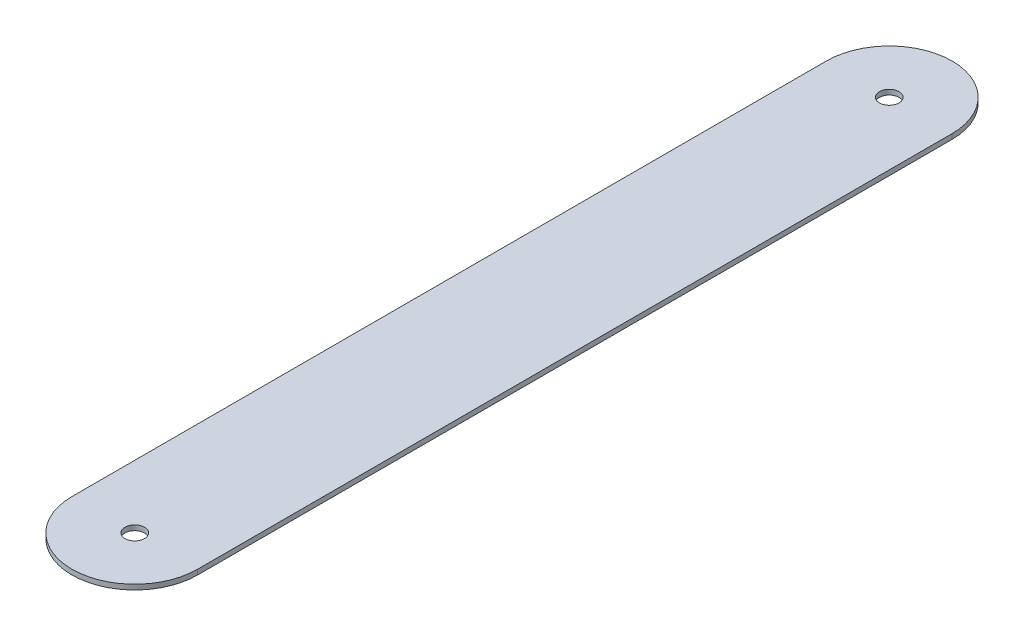
ISO-10303-21;
HEADER;
FILE_DESCRIPTION(('STEP AP214'),'2;1');
FILE_NAME('part.step','',(''),(''),'','','');
FILE_SCHEMA(('AUTOMOTIVE_DESIGN { 1 0 10303 214 1 1 1 1 }'));
ENDSEC;
DATA;
#1=APPLICATION_CONTEXT('core data for automotive mechanical design processes');
#2=APPLICATION_PROTOCOL_DEFINITION('international standard','automotive_design',2000,#1);
#3=PRODUCT_CONTEXT('',#1,'mechanical');
#4=PRODUCT('Part','Part','',(#3));
#5=PRODUCT_RELATED_PRODUCT_CATEGORY('part','',(#4));
#6=PRODUCT_DEFINITION_FORMATION('','',#4);
#7=PRODUCT_DEFINITION_CONTEXT('part definition',#1,'design');
#8=PRODUCT_DEFINITION('design','',#6,#7);
#9=PRODUCT_DEFINITION_SHAPE('','',#8);
#10=(LENGTH_UNIT() NAMED_UNIT(*) SI_UNIT(.MILLI.,.METRE.));
#11=(NAMED_UNIT(*) PLANE_ANGLE_UNIT() SI_UNIT($,.RADIAN.));
#12=(NAMED_UNIT(*) SI_UNIT($,.STERADIAN.) SOLID_ANGLE_UNIT());
#13=UNCERTAINTY_MEASURE_WITH_UNIT(LENGTH_MEASURE(1.E-05),#10,'distance_accuracy_value','');
#14=(GEOMETRIC_REPRESENTATION_CONTEXT(3) GLOBAL_UNCERTAINTY_ASSIGNED_CONTEXT((#13)) GLOBAL_UNIT_ASSIGNED_CONTEXT((#10,
#11,#12)) REPRESENTATION_CONTEXT('',''));
#15=CARTESIAN_POINT('',(0.,0.,0.));
#16=DIRECTION('',(0.,0.,1.));
#17=DIRECTION('',(1.,0.,0.));
#18=AXIS2_PLACEMENT_3D('',#15,#16,#17);
#19=CARTESIAN_POINT('',(0.,1.,0.));
#20=DIRECTION('',(0.,1.,0.));
#21=DIRECTION('',(0.,0.,1.));
#22=AXIS2_PLACEMENT_3D('',#19,#20,#21);
#23=PLANE('',#22);
#24=CARTESIAN_POINT('',(0.,1.,0.));
#25=DIRECTION('',(0.,1.,0.));
#26=DIRECTION('',(0.,0.,1.));
#27=AXIS2_PLACEMENT_3D('',#24,#25,#26);
#28=CIRCLE('',#27,1.95);
#29=CARTESIAN_POINT('',(0.,1.,1.95));
#30=VERTEX_POINT('',#29);
#31=EDGE_CURVE('E100',#30,#30,#28,.T.);
#32=ORIENTED_EDGE('',*,*,#31,.F.);
#33=EDGE_LOOP('',(#32));
#34=FACE_BOUND('',#33,.T.);
#35=CARTESIAN_POINT('',(0.,1.,0.));
#36=DIRECTION('',(0.,1.,0.));
#37=DIRECTION('',(0.,0.,1.));
#38=AXIS2_PLACEMENT_3D('',#35,#36,#37);
#39=CIRCLE('',#38,12.5);
#40=CARTESIAN_POINT('',(-12.5,1.,0.));
#41=VERTEX_POINT('',#40);
#42=CARTESIAN_POINT('',(12.5,1.,0.));
#43=VERTEX_POINT('',#42);
#44=EDGE_CURVE('E85',#41,#43,#39,.T.);
#45=ORIENTED_EDGE('',*,*,#44,.T.);
#46=DIRECTION('',(0.,0.,-1.));
#47=VECTOR('',#46,1.);
#48=CARTESIAN_POINT('',(12.5,1.,0.));
#49=LINE('',#48,#47);
#50=CARTESIAN_POINT('',(12.4999999999994,1.,-150.));
#51=VERTEX_POINT('',#50);
#52=EDGE_CURVE('E80',#43,#51,#49,.T.);
#53=ORIENTED_EDGE('',*,*,#52,.T.);
#54=CARTESIAN_POINT('',(-5.88016157781706E-13,1.,-150.));
#55=DIRECTION('',(0.,1.,0.));
#56=DIRECTION('',(0.,0.,1.));
#57=AXIS2_PLACEMENT_3D('',#54,#55,#56);
#58=CIRCLE('',#57,12.5);
#59=CARTESIAN_POINT('',(-12.5000000000006,1.,-150.));
#60=VERTEX_POINT('',#59);
#61=EDGE_CURVE('E83',#51,#60,#58,.T.);
#62=ORIENTED_EDGE('',*,*,#61,.T.);
#63=DIRECTION('',(0.,0.,1.));
#64=VECTOR('',#63,1.);
#65=CARTESIAN_POINT('',(-12.5,1.,0.));
#66=LINE('',#65,#64);
#67=EDGE_CURVE('E50',#60,#41,#66,.T.);
#68=ORIENTED_EDGE('',*,*,#67,.T.);
#69=EDGE_LOOP('',(#45,#53,#62,#68));
#70=FACE_BOUND('',#69,.T.);
#71=CARTESIAN_POINT('',(-5.88016157781706E-13,1.,-150.));
#72=DIRECTION('',(0.,1.,0.));
#73=DIRECTION('',(0.,0.,1.));
#74=AXIS2_PLACEMENT_3D('',#71,#72,#73);
#75=CIRCLE('',#74,1.95);
#76=CARTESIAN_POINT('',(-5.88016157781706E-13,1.,-148.05));
#77=VERTEX_POINT('',#76);
#78=EDGE_CURVE('E115',#77,#77,#75,.T.);
#79=ORIENTED_EDGE('',*,*,#78,.F.);
#80=EDGE_LOOP('',(#79));
#81=FACE_BOUND('',#80,.T.);
#82=ADVANCED_FACE('F33',(#34,#70,#81),#23,.T.);
#83=CARTESIAN_POINT('',(0.,0.,0.));
#84=DIRECTION('',(0.,1.,0.));
#85=DIRECTION('',(0.,0.,1.));
#86=AXIS2_PLACEMENT_3D('',#83,#84,#85);
#87=PLANE('',#86);
#88=CARTESIAN_POINT('',(0.,0.,0.));
#89=DIRECTION('',(0.,1.,0.));
#90=DIRECTION('',(0.,0.,1.));
#91=AXIS2_PLACEMENT_3D('',#88,#89,#90);
#92=CIRCLE('',#91,12.5);
#93=CARTESIAN_POINT('',(-12.5,0.,0.));
#94=VERTEX_POINT('',#93);
#95=CARTESIAN_POINT('',(12.5,0.,0.));
#96=VERTEX_POINT('',#95);
#97=EDGE_CURVE('E97',#94,#96,#92,.T.);
#98=ORIENTED_EDGE('',*,*,#97,.F.);
#99=DIRECTION('',(0.,0.,1.));
#100=VECTOR('',#99,1.);
#101=CARTESIAN_POINT('',(-12.5,0.,0.));
#102=LINE('',#101,#100);
#103=CARTESIAN_POINT('',(-12.5000000000006,0.,-150.));
#104=VERTEX_POINT('',#103);
#105=EDGE_CURVE('E73',#104,#94,#102,.T.);
#106=ORIENTED_EDGE('',*,*,#105,.F.);
#107=CARTESIAN_POINT('',(-5.88016157781706E-13,0.,-150.));
#108=DIRECTION('',(0.,1.,0.));
#109=DIRECTION('',(0.,0.,1.));
#110=AXIS2_PLACEMENT_3D('',#107,#108,#109);
#111=CIRCLE('',#110,12.5);
#112=CARTESIAN_POINT('',(12.4999999999994,0.,-150.));
#113=VERTEX_POINT('',#112);
#114=EDGE_CURVE('E67',#113,#104,#111,.T.);
#115=ORIENTED_EDGE('',*,*,#114,.F.);
#116=DIRECTION('',(0.,0.,-1.));
#117=VECTOR('',#116,1.);
#118=CARTESIAN_POINT('',(12.5,0.,0.));
#119=LINE('',#118,#117);
#120=EDGE_CURVE('E89',#96,#113,#119,.T.);
#121=ORIENTED_EDGE('',*,*,#120,.F.);
#122=EDGE_LOOP('',(#98,#106,#115,#121));
#123=FACE_BOUND('',#122,.T.);
#124=CARTESIAN_POINT('',(0.,0.,0.));
#125=DIRECTION('',(0.,1.,0.));
#126=DIRECTION('',(0.,0.,1.));
#127=AXIS2_PLACEMENT_3D('',#124,#125,#126);
#128=CIRCLE('',#127,1.95);
#129=CARTESIAN_POINT('',(0.,0.,1.95));
#130=VERTEX_POINT('',#129);
#131=EDGE_CURVE('E112',#130,#130,#128,.T.);
#132=ORIENTED_EDGE('',*,*,#131,.T.);
#133=EDGE_LOOP('',(#132));
#134=FACE_BOUND('',#133,.T.);
#135=CARTESIAN_POINT('',(-5.88016157781706E-13,0.,-150.));
#136=DIRECTION('',(0.,1.,0.));
#137=DIRECTION('',(0.,0.,1.));
#138=AXIS2_PLACEMENT_3D('',#135,#136,#137);
#139=CIRCLE('',#138,1.95);
#140=CARTESIAN_POINT('',(-5.88016157781706E-13,0.,-148.05));
#141=VERTEX_POINT('',#140);
#142=EDGE_CURVE('E118',#141,#141,#139,.T.);
#143=ORIENTED_EDGE('',*,*,#142,.T.);
#144=EDGE_LOOP('',(#143));
#145=FACE_BOUND('',#144,.T.);
#146=ADVANCED_FACE('F108',(#123,#134,#145),#87,.F.);
#147=CARTESIAN_POINT('',(0.,1.,0.));
#148=DIRECTION('',(0.,-1.,0.));
#149=DIRECTION('',(0.,0.,-1.));
#150=AXIS2_PLACEMENT_3D('',#147,#148,#149);
#151=CYLINDRICAL_SURFACE('',#150,12.5);
#152=ORIENTED_EDGE('',*,*,#97,.T.);
#153=DIRECTION('',(0.,-1.,0.));
#154=VECTOR('',#153,1.);
#155=CARTESIAN_POINT('',(12.5,1.,0.));
#156=LINE('',#155,#154);
#157=EDGE_CURVE('E11',#43,#96,#156,.T.);
#158=ORIENTED_EDGE('',*,*,#157,.F.);
#159=ORIENTED_EDGE('',*,*,#44,.F.);
#160=DIRECTION('',(0.,-1.,0.));
#161=VECTOR('',#160,1.);
#162=CARTESIAN_POINT('',(-12.5,1.,0.));
#163=LINE('',#162,#161);
#164=EDGE_CURVE('E93',#41,#94,#163,.T.);
#165=ORIENTED_EDGE('',*,*,#164,.T.);
#166=EDGE_LOOP('',(#152,#158,#159,#165));
#167=FACE_BOUND('',#166,.T.);
#168=ADVANCED_FACE('F35',(#167),#151,.T.);
#169=CARTESIAN_POINT('',(12.5,1.,0.));
#170=DIRECTION('',(-1.,0.,0.));
#171=DIRECTION('',(0.,0.,1.));
#172=AXIS2_PLACEMENT_3D('',#169,#170,#171);
#173=PLANE('',#172);
#174=ORIENTED_EDGE('',*,*,#120,.T.);
#175=DIRECTION('',(0.,-1.,0.));
#176=VECTOR('',#175,1.);
#177=CARTESIAN_POINT('',(12.4999999999994,1.,-150.));
#178=LINE('',#177,#176);
#179=EDGE_CURVE('E42',#51,#113,#178,.T.);
#180=ORIENTED_EDGE('',*,*,#179,.F.);
#181=ORIENTED_EDGE('',*,*,#52,.F.);
#182=ORIENTED_EDGE('',*,*,#157,.T.);
#183=EDGE_LOOP('',(#174,#180,#181,#182));
#184=FACE_BOUND('',#183,.T.);
#185=ADVANCED_FACE('F88',(#184),#173,.F.);
#186=CARTESIAN_POINT('',(-5.88016157781706E-13,1.,-150.));
#187=DIRECTION('',(0.,-1.,0.));
#188=DIRECTION('',(0.,0.,-1.));
#189=AXIS2_PLACEMENT_3D('',#186,#187,#188);
#190=CYLINDRICAL_SURFACE('',#189,12.5);
#191=ORIENTED_EDGE('',*,*,#114,.T.);
#192=DIRECTION('',(0.,-1.,0.));
#193=VECTOR('',#192,1.);
#194=CARTESIAN_POINT('',(-12.5000000000006,1.,-150.));
#195=LINE('',#194,#193);
#196=EDGE_CURVE('E90',#60,#104,#195,.T.);
#197=ORIENTED_EDGE('',*,*,#196,.F.);
#198=ORIENTED_EDGE('',*,*,#61,.F.);
#199=ORIENTED_EDGE('',*,*,#179,.T.);
#200=EDGE_LOOP('',(#191,#197,#198,#199));
#201=FACE_BOUND('',#200,.T.);
#202=ADVANCED_FACE('F91',(#201),#190,.T.);
#203=CARTESIAN_POINT('',(-12.5,1.,0.));
#204=DIRECTION('',(1.,0.,0.));
#205=DIRECTION('',(0.,0.,-1.));
#206=AXIS2_PLACEMENT_3D('',#203,#204,#205);
#207=PLANE('',#206);
#208=ORIENTED_EDGE('',*,*,#105,.T.);
#209=ORIENTED_EDGE('',*,*,#164,.F.);
#210=ORIENTED_EDGE('',*,*,#67,.F.);
#211=ORIENTED_EDGE('',*,*,#196,.T.);
#212=EDGE_LOOP('',(#208,#209,#210,#211));
#213=FACE_BOUND('',#212,.T.);
#214=ADVANCED_FACE('F105',(#213),#207,.F.);
#215=CARTESIAN_POINT('',(0.,1.,0.));
#216=DIRECTION('',(0.,-1.,0.));
#217=DIRECTION('',(0.,0.,-1.));
#218=AXIS2_PLACEMENT_3D('',#215,#216,#217);
#219=CYLINDRICAL_SURFACE('',#218,1.95);
#220=ORIENTED_EDGE('',*,*,#31,.T.);
#221=EDGE_LOOP('',(#220));
#222=FACE_BOUND('',#221,.T.);
#223=ORIENTED_EDGE('',*,*,#131,.F.);
#224=EDGE_LOOP('',(#223));
#225=FACE_BOUND('',#224,.T.);
#226=ADVANCED_FACE('F135',(#222,#225),#219,.F.);
#227=CARTESIAN_POINT('',(-5.88016157781706E-13,1.,-150.));
#228=DIRECTION('',(0.,-1.,0.));
#229=DIRECTION('',(0.,0.,-1.));
#230=AXIS2_PLACEMENT_3D('',#227,#228,#229);
#231=CYLINDRICAL_SURFACE('',#230,1.95);
#232=ORIENTED_EDGE('',*,*,#78,.T.);
#233=EDGE_LOOP('',(#232));
#234=FACE_BOUND('',#233,.T.);
#235=ORIENTED_EDGE('',*,*,#142,.F.);
#236=EDGE_LOOP('',(#235));
#237=FACE_BOUND('',#236,.T.);
#238=ADVANCED_FACE('F124',(#234,#237),#231,.F.);
#239=CLOSED_SHELL('',(#82,#146,#168,#185,#202,#214,#226,#238));
#240=MANIFOLD_SOLID_BREP('B2',#239);
#241=ADVANCED_BREP_SHAPE_REPRESENTATION('',(#18,#240),#14);
#242=SHAPE_DEFINITION_REPRESENTATION(#9,#241);
ENDSEC;
END-ISO-10303-21;
